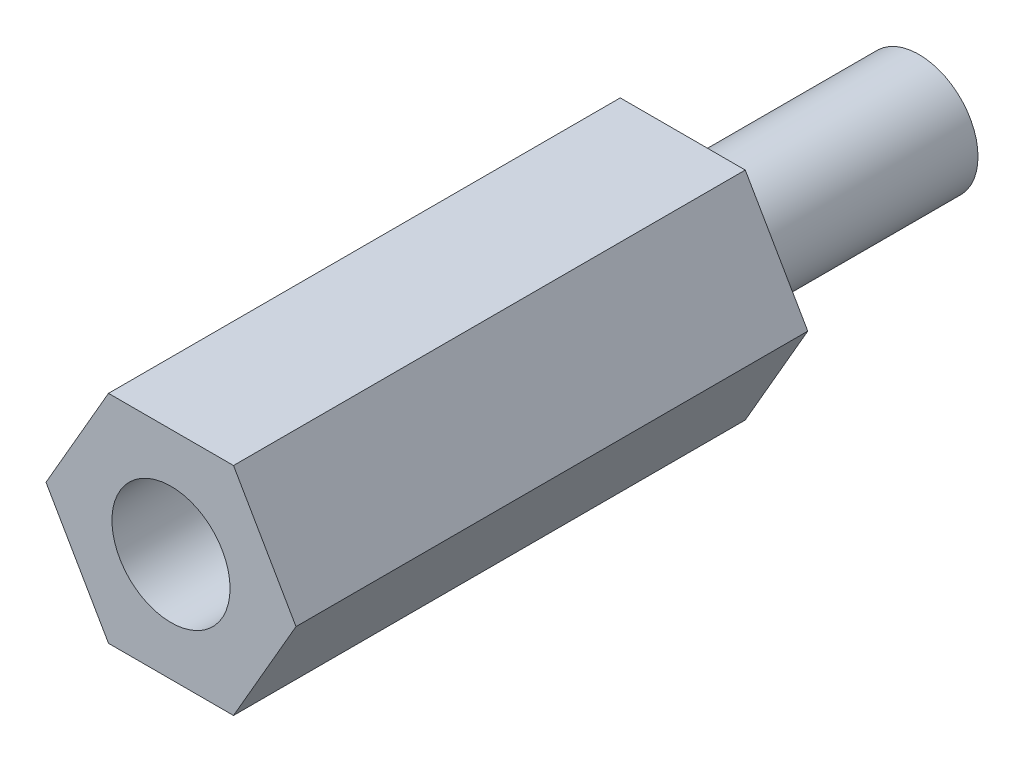
ISO-10303-21;
HEADER;
FILE_DESCRIPTION(('STEP AP214'),'2;1');
FILE_NAME('part.step','',(''),(''),'','','');
FILE_SCHEMA(('AUTOMOTIVE_DESIGN { 1 0 10303 214 1 1 1 1 }'));
ENDSEC;
DATA;
#1=APPLICATION_CONTEXT('core data for automotive mechanical design processes');
#2=APPLICATION_PROTOCOL_DEFINITION('international standard','automotive_design',2000,#1);
#3=PRODUCT_CONTEXT('',#1,'mechanical');
#4=PRODUCT('Part','Part','',(#3));
#5=PRODUCT_RELATED_PRODUCT_CATEGORY('part','',(#4));
#6=PRODUCT_DEFINITION_FORMATION('','',#4);
#7=PRODUCT_DEFINITION_CONTEXT('part definition',#1,'design');
#8=PRODUCT_DEFINITION('design','',#6,#7);
#9=PRODUCT_DEFINITION_SHAPE('','',#8);
#10=(LENGTH_UNIT() NAMED_UNIT(*) SI_UNIT(.MILLI.,.METRE.));
#11=(NAMED_UNIT(*) PLANE_ANGLE_UNIT() SI_UNIT($,.RADIAN.));
#12=(NAMED_UNIT(*) SI_UNIT($,.STERADIAN.) SOLID_ANGLE_UNIT());
#13=UNCERTAINTY_MEASURE_WITH_UNIT(LENGTH_MEASURE(1.E-05),#10,'distance_accuracy_value','');
#14=(GEOMETRIC_REPRESENTATION_CONTEXT(3) GLOBAL_UNCERTAINTY_ASSIGNED_CONTEXT((#13)) GLOBAL_UNIT_ASSIGNED_CONTEXT((#10,
#11,#12)) REPRESENTATION_CONTEXT('',''));
#15=CARTESIAN_POINT('',(0.,0.,0.));
#16=DIRECTION('',(0.,0.,1.));
#17=DIRECTION('',(1.,0.,0.));
#18=AXIS2_PLACEMENT_3D('',#15,#16,#17);
#19=CARTESIAN_POINT('',(3.17542648054294,0.,13.));
#20=DIRECTION('',(-0.866025403784438,-0.5,0.));
#21=DIRECTION('',(0.5,-0.866025403784438,0.));
#22=AXIS2_PLACEMENT_3D('',#19,#20,#21);
#23=PLANE('',#22);
#24=DIRECTION('',(-0.5,0.866025403784439,0.));
#25=VECTOR('',#24,1.);
#26=CARTESIAN_POINT('',(3.17542648054294,0.,0.));
#27=LINE('',#26,#25);
#28=CARTESIAN_POINT('',(3.17542648054294,0.,0.));
#29=VERTEX_POINT('',#28);
#30=CARTESIAN_POINT('',(1.58771324027147,2.75,0.));
#31=VERTEX_POINT('',#30);
#32=EDGE_CURVE('E131',#29,#31,#27,.T.);
#33=ORIENTED_EDGE('',*,*,#32,.T.);
#34=DIRECTION('',(0.,0.,-1.));
#35=VECTOR('',#34,1.);
#36=CARTESIAN_POINT('',(1.58771324027147,2.75,13.));
#37=LINE('',#36,#35);
#38=CARTESIAN_POINT('',(1.58771324027147,2.75,13.));
#39=VERTEX_POINT('',#38);
#40=EDGE_CURVE('E11',#39,#31,#37,.T.);
#41=ORIENTED_EDGE('',*,*,#40,.F.);
#42=DIRECTION('',(-0.5,0.866025403784439,0.));
#43=VECTOR('',#42,1.);
#44=CARTESIAN_POINT('',(3.17542648054294,0.,13.));
#45=LINE('',#44,#43);
#46=CARTESIAN_POINT('',(3.17542648054294,0.,13.));
#47=VERTEX_POINT('',#46);
#48=EDGE_CURVE('E151',#47,#39,#45,.T.);
#49=ORIENTED_EDGE('',*,*,#48,.F.);
#50=DIRECTION('',(0.,0.,-1.));
#51=VECTOR('',#50,1.);
#52=CARTESIAN_POINT('',(3.17542648054294,0.,13.));
#53=LINE('',#52,#51);
#54=EDGE_CURVE('E128',#47,#29,#53,.T.);
#55=ORIENTED_EDGE('',*,*,#54,.T.);
#56=EDGE_LOOP('',(#33,#41,#49,#55));
#57=FACE_BOUND('',#56,.T.);
#58=ADVANCED_FACE('F44',(#57),#23,.F.);
#59=CARTESIAN_POINT('',(1.58771324027147,2.75,13.));
#60=DIRECTION('',(0.,-1.,0.));
#61=DIRECTION('',(1.,0.,0.));
#62=AXIS2_PLACEMENT_3D('',#59,#60,#61);
#63=PLANE('',#62);
#64=DIRECTION('',(-1.,0.,0.));
#65=VECTOR('',#64,1.);
#66=CARTESIAN_POINT('',(1.58771324027147,2.75,0.));
#67=LINE('',#66,#65);
#68=CARTESIAN_POINT('',(-1.58771324027147,2.75,0.));
#69=VERTEX_POINT('',#68);
#70=EDGE_CURVE('E139',#31,#69,#67,.T.);
#71=ORIENTED_EDGE('',*,*,#70,.T.);
#72=DIRECTION('',(0.,0.,-1.));
#73=VECTOR('',#72,1.);
#74=CARTESIAN_POINT('',(-1.58771324027147,2.75,13.));
#75=LINE('',#74,#73);
#76=CARTESIAN_POINT('',(-1.58771324027147,2.75,13.));
#77=VERTEX_POINT('',#76);
#78=EDGE_CURVE('E53',#77,#69,#75,.T.);
#79=ORIENTED_EDGE('',*,*,#78,.F.);
#80=DIRECTION('',(-1.,0.,0.));
#81=VECTOR('',#80,1.);
#82=CARTESIAN_POINT('',(1.58771324027147,2.75,13.));
#83=LINE('',#82,#81);
#84=EDGE_CURVE('E97',#39,#77,#83,.T.);
#85=ORIENTED_EDGE('',*,*,#84,.F.);
#86=ORIENTED_EDGE('',*,*,#40,.T.);
#87=EDGE_LOOP('',(#71,#79,#85,#86));
#88=FACE_BOUND('',#87,.T.);
#89=ADVANCED_FACE('F182',(#88),#63,.F.);
#90=CARTESIAN_POINT('',(-1.58771324027147,2.75,13.));
#91=DIRECTION('',(0.866025403784439,-0.5,0.));
#92=DIRECTION('',(0.5,0.866025403784439,0.));
#93=AXIS2_PLACEMENT_3D('',#90,#91,#92);
#94=PLANE('',#93);
#95=DIRECTION('',(-0.5,-0.866025403784439,0.));
#96=VECTOR('',#95,1.);
#97=CARTESIAN_POINT('',(-1.58771324027147,2.75,0.));
#98=LINE('',#97,#96);
#99=CARTESIAN_POINT('',(-3.17542648054294,0.,0.));
#100=VERTEX_POINT('',#99);
#101=EDGE_CURVE('E142',#69,#100,#98,.T.);
#102=ORIENTED_EDGE('',*,*,#101,.T.);
#103=DIRECTION('',(0.,0.,-1.));
#104=VECTOR('',#103,1.);
#105=CARTESIAN_POINT('',(-3.17542648054294,0.,13.));
#106=LINE('',#105,#104);
#107=CARTESIAN_POINT('',(-3.17542648054294,0.,13.));
#108=VERTEX_POINT('',#107);
#109=EDGE_CURVE('E124',#108,#100,#106,.T.);
#110=ORIENTED_EDGE('',*,*,#109,.F.);
#111=DIRECTION('',(-0.5,-0.866025403784439,0.));
#112=VECTOR('',#111,1.);
#113=CARTESIAN_POINT('',(-1.58771324027147,2.75,13.));
#114=LINE('',#113,#112);
#115=EDGE_CURVE('E115',#77,#108,#114,.T.);
#116=ORIENTED_EDGE('',*,*,#115,.F.);
#117=ORIENTED_EDGE('',*,*,#78,.T.);
#118=EDGE_LOOP('',(#102,#110,#116,#117));
#119=FACE_BOUND('',#118,.T.);
#120=ADVANCED_FACE('F161',(#119),#94,.F.);
#121=CARTESIAN_POINT('',(-3.17542648054294,0.,13.));
#122=DIRECTION('',(0.866025403784438,0.500000000000001,0.));
#123=DIRECTION('',(-0.500000000000001,0.866025403784438,0.));
#124=AXIS2_PLACEMENT_3D('',#121,#122,#123);
#125=PLANE('',#124);
#126=DIRECTION('',(0.5,-0.866025403784438,0.));
#127=VECTOR('',#126,1.);
#128=CARTESIAN_POINT('',(-3.17542648054294,0.,0.));
#129=LINE('',#128,#127);
#130=CARTESIAN_POINT('',(-1.58771324027147,-2.75,0.));
#131=VERTEX_POINT('',#130);
#132=EDGE_CURVE('E122',#100,#131,#129,.T.);
#133=ORIENTED_EDGE('',*,*,#132,.T.);
#134=DIRECTION('',(0.,0.,-1.));
#135=VECTOR('',#134,1.);
#136=CARTESIAN_POINT('',(-1.58771324027147,-2.75,13.));
#137=LINE('',#136,#135);
#138=CARTESIAN_POINT('',(-1.58771324027147,-2.75,13.));
#139=VERTEX_POINT('',#138);
#140=EDGE_CURVE('E119',#139,#131,#137,.T.);
#141=ORIENTED_EDGE('',*,*,#140,.F.);
#142=DIRECTION('',(0.5,-0.866025403784438,0.));
#143=VECTOR('',#142,1.);
#144=CARTESIAN_POINT('',(-3.17542648054294,0.,13.));
#145=LINE('',#144,#143);
#146=EDGE_CURVE('E106',#108,#139,#145,.T.);
#147=ORIENTED_EDGE('',*,*,#146,.F.);
#148=ORIENTED_EDGE('',*,*,#109,.T.);
#149=EDGE_LOOP('',(#133,#141,#147,#148));
#150=FACE_BOUND('',#149,.T.);
#151=ADVANCED_FACE('F116',(#150),#125,.F.);
#152=CARTESIAN_POINT('',(-1.58771324027147,-2.75,13.));
#153=DIRECTION('',(0.,1.,0.));
#154=DIRECTION('',(-1.,0.,0.));
#155=AXIS2_PLACEMENT_3D('',#152,#153,#154);
#156=PLANE('',#155);
#157=DIRECTION('',(1.,0.,0.));
#158=VECTOR('',#157,1.);
#159=CARTESIAN_POINT('',(-1.58771324027147,-2.75,0.));
#160=LINE('',#159,#158);
#161=CARTESIAN_POINT('',(1.58771324027147,-2.75,0.));
#162=VERTEX_POINT('',#161);
#163=EDGE_CURVE('E83',#131,#162,#160,.T.);
#164=ORIENTED_EDGE('',*,*,#163,.T.);
#165=DIRECTION('',(0.,0.,-1.));
#166=VECTOR('',#165,1.);
#167=CARTESIAN_POINT('',(1.58771324027147,-2.75,13.));
#168=LINE('',#167,#166);
#169=CARTESIAN_POINT('',(1.58771324027147,-2.75,13.));
#170=VERTEX_POINT('',#169);
#171=EDGE_CURVE('E121',#170,#162,#168,.T.);
#172=ORIENTED_EDGE('',*,*,#171,.F.);
#173=DIRECTION('',(1.,0.,0.));
#174=VECTOR('',#173,1.);
#175=CARTESIAN_POINT('',(-1.58771324027147,-2.75,13.));
#176=LINE('',#175,#174);
#177=EDGE_CURVE('E109',#139,#170,#176,.T.);
#178=ORIENTED_EDGE('',*,*,#177,.F.);
#179=ORIENTED_EDGE('',*,*,#140,.T.);
#180=EDGE_LOOP('',(#164,#172,#178,#179));
#181=FACE_BOUND('',#180,.T.);
#182=ADVANCED_FACE('F127',(#181),#156,.F.);
#183=CARTESIAN_POINT('',(1.58771324027147,-2.75,13.));
#184=DIRECTION('',(-0.866025403784439,0.5,0.));
#185=DIRECTION('',(-0.5,-0.866025403784439,0.));
#186=AXIS2_PLACEMENT_3D('',#183,#184,#185);
#187=PLANE('',#186);
#188=DIRECTION('',(0.5,0.866025403784439,0.));
#189=VECTOR('',#188,1.);
#190=CARTESIAN_POINT('',(1.58771324027147,-2.75,0.));
#191=LINE('',#190,#189);
#192=EDGE_CURVE('E93',#162,#29,#191,.T.);
#193=ORIENTED_EDGE('',*,*,#192,.T.);
#194=ORIENTED_EDGE('',*,*,#54,.F.);
#195=DIRECTION('',(0.5,0.866025403784439,0.));
#196=VECTOR('',#195,1.);
#197=CARTESIAN_POINT('',(1.58771324027147,-2.75,13.));
#198=LINE('',#197,#196);
#199=EDGE_CURVE('E65',#170,#47,#198,.T.);
#200=ORIENTED_EDGE('',*,*,#199,.F.);
#201=ORIENTED_EDGE('',*,*,#171,.T.);
#202=EDGE_LOOP('',(#193,#194,#200,#201));
#203=FACE_BOUND('',#202,.T.);
#204=ADVANCED_FACE('F169',(#203),#187,.F.);
#205=CARTESIAN_POINT('',(0.,0.,13.));
#206=DIRECTION('',(0.,0.,1.));
#207=DIRECTION('',(1.,0.,0.));
#208=AXIS2_PLACEMENT_3D('',#205,#206,#207);
#209=PLANE('',#208);
#210=CARTESIAN_POINT('',(0.,0.,13.));
#211=DIRECTION('',(0.,0.,1.));
#212=DIRECTION('',(1.,0.,0.));
#213=AXIS2_PLACEMENT_3D('',#210,#211,#212);
#214=CIRCLE('',#213,1.5);
#215=CARTESIAN_POINT('',(1.5,0.,13.));
#216=VERTEX_POINT('',#215);
#217=EDGE_CURVE('E266',#216,#216,#214,.T.);
#218=ORIENTED_EDGE('',*,*,#217,.F.);
#219=EDGE_LOOP('',(#218));
#220=FACE_BOUND('',#219,.T.);
#221=ORIENTED_EDGE('',*,*,#48,.T.);
#222=ORIENTED_EDGE('',*,*,#84,.T.);
#223=ORIENTED_EDGE('',*,*,#115,.T.);
#224=ORIENTED_EDGE('',*,*,#146,.T.);
#225=ORIENTED_EDGE('',*,*,#177,.T.);
#226=ORIENTED_EDGE('',*,*,#199,.T.);
#227=EDGE_LOOP('',(#221,#222,#223,#224,#225,#226));
#228=FACE_BOUND('',#227,.T.);
#229=ADVANCED_FACE('F107',(#220,#228),#209,.T.);
#230=CARTESIAN_POINT('',(0.,0.,0.));
#231=DIRECTION('',(0.,0.,1.));
#232=DIRECTION('',(1.,0.,0.));
#233=AXIS2_PLACEMENT_3D('',#230,#231,#232);
#234=PLANE('',#233);
#235=CARTESIAN_POINT('',(0.,0.,0.));
#236=DIRECTION('',(0.,0.,1.));
#237=DIRECTION('',(1.,0.,0.));
#238=AXIS2_PLACEMENT_3D('',#235,#236,#237);
#239=CIRCLE('',#238,1.5);
#240=CARTESIAN_POINT('',(1.5,0.,0.));
#241=VERTEX_POINT('',#240);
#242=EDGE_CURVE('E264',#241,#241,#239,.T.);
#243=ORIENTED_EDGE('',*,*,#242,.T.);
#244=EDGE_LOOP('',(#243));
#245=FACE_BOUND('',#244,.T.);
#246=ORIENTED_EDGE('',*,*,#32,.F.);
#247=ORIENTED_EDGE('',*,*,#192,.F.);
#248=ORIENTED_EDGE('',*,*,#163,.F.);
#249=ORIENTED_EDGE('',*,*,#132,.F.);
#250=ORIENTED_EDGE('',*,*,#101,.F.);
#251=ORIENTED_EDGE('',*,*,#70,.F.);
#252=EDGE_LOOP('',(#246,#247,#248,#249,#250,#251));
#253=FACE_BOUND('',#252,.T.);
#254=ADVANCED_FACE('F163',(#245,#253),#234,.F.);
#255=CARTESIAN_POINT('',(0.,0.,-6.));
#256=DIRECTION('',(0.,0.,1.));
#257=DIRECTION('',(1.,0.,0.));
#258=AXIS2_PLACEMENT_3D('',#255,#256,#257);
#259=CYLINDRICAL_SURFACE('',#258,1.5);
#260=CARTESIAN_POINT('',(0.,0.,-6.));
#261=DIRECTION('',(0.,0.,1.));
#262=DIRECTION('',(1.,0.,0.));
#263=AXIS2_PLACEMENT_3D('',#260,#261,#262);
#264=CIRCLE('',#263,1.5);
#265=CARTESIAN_POINT('',(1.5,0.,-6.));
#266=VERTEX_POINT('',#265);
#267=EDGE_CURVE('E136',#266,#266,#264,.T.);
#268=ORIENTED_EDGE('',*,*,#267,.T.);
#269=EDGE_LOOP('',(#268));
#270=FACE_BOUND('',#269,.T.);
#271=ORIENTED_EDGE('',*,*,#242,.F.);
#272=EDGE_LOOP('',(#271));
#273=FACE_BOUND('',#272,.T.);
#274=ADVANCED_FACE('F222',(#270,#273),#259,.T.);
#275=CARTESIAN_POINT('',(0.,0.,-6.));
#276=DIRECTION('',(0.,0.,1.));
#277=DIRECTION('',(1.,0.,0.));
#278=AXIS2_PLACEMENT_3D('',#275,#276,#277);
#279=PLANE('',#278);
#280=ORIENTED_EDGE('',*,*,#267,.F.);
#281=EDGE_LOOP('',(#280));
#282=FACE_BOUND('',#281,.T.);
#283=ADVANCED_FACE('F228',(#282),#279,.F.);
#284=CARTESIAN_POINT('',(0.,0.,7.));
#285=DIRECTION('',(0.,0.,1.));
#286=DIRECTION('',(1.,0.,0.));
#287=AXIS2_PLACEMENT_3D('',#284,#285,#286);
#288=CYLINDRICAL_SURFACE('',#287,1.5);
#289=CARTESIAN_POINT('',(0.,0.,7.));
#290=DIRECTION('',(0.,0.,1.));
#291=DIRECTION('',(1.,0.,0.));
#292=AXIS2_PLACEMENT_3D('',#289,#290,#291);
#293=CIRCLE('',#292,1.5);
#294=CARTESIAN_POINT('',(1.5,0.,7.));
#295=VERTEX_POINT('',#294);
#296=EDGE_CURVE('E263',#295,#295,#293,.T.);
#297=ORIENTED_EDGE('',*,*,#296,.F.);
#298=EDGE_LOOP('',(#297));
#299=FACE_BOUND('',#298,.T.);
#300=ORIENTED_EDGE('',*,*,#217,.T.);
#301=EDGE_LOOP('',(#300));
#302=FACE_BOUND('',#301,.T.);
#303=ADVANCED_FACE('F239',(#299,#302),#288,.F.);
#304=CARTESIAN_POINT('',(0.,0.,7.));
#305=DIRECTION('',(0.,0.,1.));
#306=DIRECTION('',(1.,0.,0.));
#307=AXIS2_PLACEMENT_3D('',#304,#305,#306);
#308=PLANE('',#307);
#309=ORIENTED_EDGE('',*,*,#296,.T.);
#310=EDGE_LOOP('',(#309));
#311=FACE_BOUND('',#310,.T.);
#312=ADVANCED_FACE('F249',(#311),#308,.T.);
#313=CLOSED_SHELL('',(#58,#89,#120,#151,#182,#204,#229,#254,#274,#283,#303,#312));
#314=MANIFOLD_SOLID_BREP('B2',#313);
#315=ADVANCED_BREP_SHAPE_REPRESENTATION('',(#18,#314),#14);
#316=SHAPE_DEFINITION_REPRESENTATION(#9,#315);
ENDSEC;
END-ISO-10303-21;
